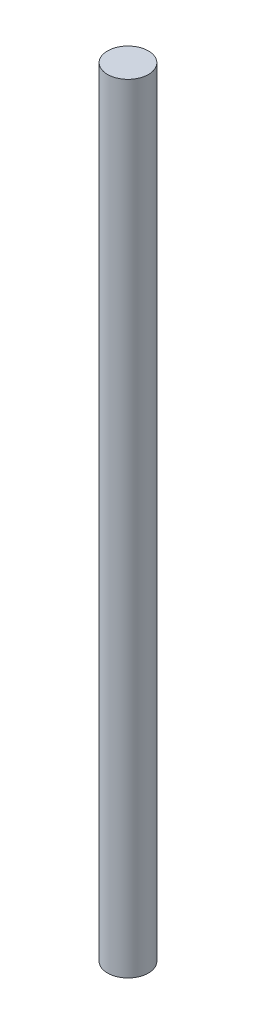
ISO-10303-21;
HEADER;
FILE_DESCRIPTION(('STEP AP214'),'2;1');
FILE_NAME('part.step','',(''),(''),'','','');
FILE_SCHEMA(('AUTOMOTIVE_DESIGN { 1 0 10303 214 1 1 1 1 }'));
ENDSEC;
DATA;
#1=APPLICATION_CONTEXT('core data for automotive mechanical design processes');
#2=APPLICATION_PROTOCOL_DEFINITION('international standard','automotive_design',2000,#1);
#3=PRODUCT_CONTEXT('',#1,'mechanical');
#4=PRODUCT('Part','Part','',(#3));
#5=PRODUCT_RELATED_PRODUCT_CATEGORY('part','',(#4));
#6=PRODUCT_DEFINITION_FORMATION('','',#4);
#7=PRODUCT_DEFINITION_CONTEXT('part definition',#1,'design');
#8=PRODUCT_DEFINITION('design','',#6,#7);
#9=PRODUCT_DEFINITION_SHAPE('','',#8);
#10=(LENGTH_UNIT() NAMED_UNIT(*) SI_UNIT(.MILLI.,.METRE.));
#11=(NAMED_UNIT(*) PLANE_ANGLE_UNIT() SI_UNIT($,.RADIAN.));
#12=(NAMED_UNIT(*) SI_UNIT($,.STERADIAN.) SOLID_ANGLE_UNIT());
#13=UNCERTAINTY_MEASURE_WITH_UNIT(LENGTH_MEASURE(1.E-05),#10,'distance_accuracy_value','');
#14=(GEOMETRIC_REPRESENTATION_CONTEXT(3) GLOBAL_UNCERTAINTY_ASSIGNED_CONTEXT((#13)) GLOBAL_UNIT_ASSIGNED_CONTEXT((#10,
#11,#12)) REPRESENTATION_CONTEXT('',''));
#15=CARTESIAN_POINT('',(0.,0.,0.));
#16=DIRECTION('',(0.,0.,1.));
#17=DIRECTION('',(1.,0.,0.));
#18=AXIS2_PLACEMENT_3D('',#15,#16,#17);
#19=CARTESIAN_POINT('',(-78.2984721973149,16.,-14.3666921462963));
#20=DIRECTION('',(0.,-1.,0.));
#21=DIRECTION('',(0.,0.,-1.));
#22=AXIS2_PLACEMENT_3D('',#19,#20,#21);
#23=CYLINDRICAL_SURFACE('',#22,0.419999999999998);
#24=CARTESIAN_POINT('',(-78.2984721973149,16.,-14.3666921462963));
#25=DIRECTION('',(0.,1.,0.));
#26=DIRECTION('',(0.,0.,1.));
#27=AXIS2_PLACEMENT_3D('',#24,#25,#26);
#28=CIRCLE('',#27,0.419999999999998);
#29=CARTESIAN_POINT('',(-78.2984721973149,16.,-13.9466921462963));
#30=VERTEX_POINT('',#29);
#31=EDGE_CURVE('E10',#30,#30,#28,.T.);
#32=ORIENTED_EDGE('',*,*,#31,.F.);
#33=EDGE_LOOP('',(#32));
#34=FACE_BOUND('',#33,.T.);
#35=CARTESIAN_POINT('',(-78.2984721973149,0.,-14.3666921462963));
#36=DIRECTION('',(0.,1.,0.));
#37=DIRECTION('',(0.,0.,1.));
#38=AXIS2_PLACEMENT_3D('',#35,#36,#37);
#39=CIRCLE('',#38,0.419999999999998);
#40=CARTESIAN_POINT('',(-78.2984721973149,0.,-13.9466921462963));
#41=VERTEX_POINT('',#40);
#42=EDGE_CURVE('E37',#41,#41,#39,.T.);
#43=ORIENTED_EDGE('',*,*,#42,.T.);
#44=EDGE_LOOP('',(#43));
#45=FACE_BOUND('',#44,.T.);
#46=ADVANCED_FACE('F40',(#34,#45),#23,.T.);
#47=CARTESIAN_POINT('',(-78.2984721973149,16.,-14.3666921462963));
#48=DIRECTION('',(0.,1.,0.));
#49=DIRECTION('',(0.,0.,1.));
#50=AXIS2_PLACEMENT_3D('',#47,#48,#49);
#51=PLANE('',#50);
#52=ORIENTED_EDGE('',*,*,#31,.T.);
#53=EDGE_LOOP('',(#52));
#54=FACE_BOUND('',#53,.T.);
#55=ADVANCED_FACE('F55',(#54),#51,.T.);
#56=CARTESIAN_POINT('',(-78.2984721973149,0.,-14.3666921462963));
#57=DIRECTION('',(0.,1.,0.));
#58=DIRECTION('',(0.,0.,1.));
#59=AXIS2_PLACEMENT_3D('',#56,#57,#58);
#60=PLANE('',#59);
#61=ORIENTED_EDGE('',*,*,#42,.F.);
#62=EDGE_LOOP('',(#61));
#63=FACE_BOUND('',#62,.T.);
#64=ADVANCED_FACE('F49',(#63),#60,.F.);
#65=CLOSED_SHELL('',(#46,#55,#64));
#66=MANIFOLD_SOLID_BREP('B2',#65);
#67=ADVANCED_BREP_SHAPE_REPRESENTATION('',(#18,#66),#14);
#68=SHAPE_DEFINITION_REPRESENTATION(#9,#67);
ENDSEC;
END-ISO-10303-21;
